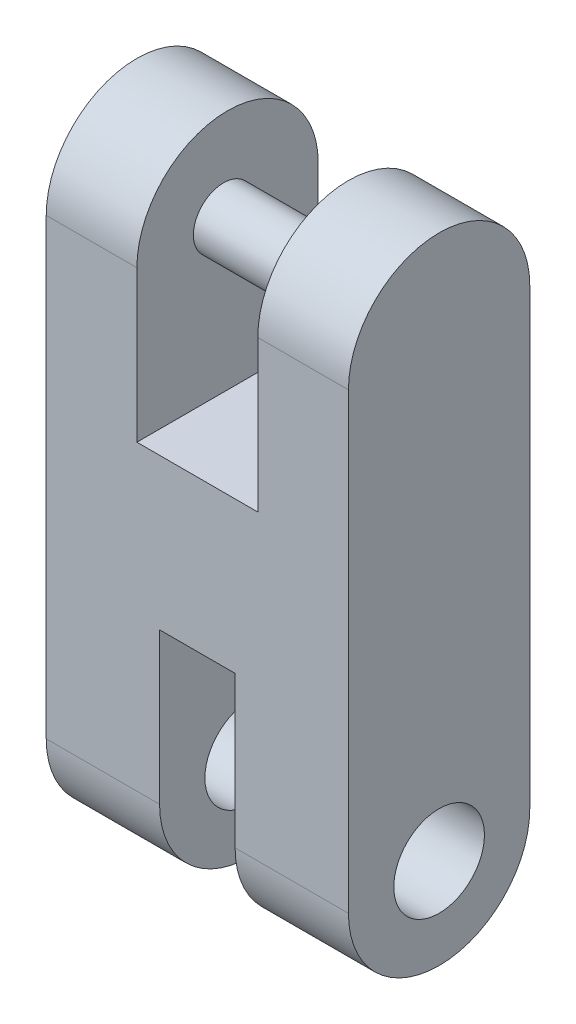
ISO-10303-21;
HEADER;
FILE_DESCRIPTION(('STEP AP214'),'2;1');
FILE_NAME('part.step','',(''),(''),'','','');
FILE_SCHEMA(('AUTOMOTIVE_DESIGN { 1 0 10303 214 1 1 1 1 }'));
ENDSEC;
DATA;
#1=APPLICATION_CONTEXT('core data for automotive mechanical design processes');
#2=APPLICATION_PROTOCOL_DEFINITION('international standard','automotive_design',2000,#1);
#3=PRODUCT_CONTEXT('',#1,'mechanical');
#4=PRODUCT('Part','Part','',(#3));
#5=PRODUCT_RELATED_PRODUCT_CATEGORY('part','',(#4));
#6=PRODUCT_DEFINITION_FORMATION('','',#4);
#7=PRODUCT_DEFINITION_CONTEXT('part definition',#1,'design');
#8=PRODUCT_DEFINITION('design','',#6,#7);
#9=PRODUCT_DEFINITION_SHAPE('','',#8);
#10=(LENGTH_UNIT() NAMED_UNIT(*) SI_UNIT(.MILLI.,.METRE.));
#11=(NAMED_UNIT(*) PLANE_ANGLE_UNIT() SI_UNIT($,.RADIAN.));
#12=(NAMED_UNIT(*) SI_UNIT($,.STERADIAN.) SOLID_ANGLE_UNIT());
#13=UNCERTAINTY_MEASURE_WITH_UNIT(LENGTH_MEASURE(1.E-05),#10,'distance_accuracy_value','');
#14=(GEOMETRIC_REPRESENTATION_CONTEXT(3) GLOBAL_UNCERTAINTY_ASSIGNED_CONTEXT((#13)) GLOBAL_UNIT_ASSIGNED_CONTEXT((#10,
#11,#12)) REPRESENTATION_CONTEXT('',''));
#15=CARTESIAN_POINT('',(0.,0.,0.));
#16=DIRECTION('',(0.,0.,1.));
#17=DIRECTION('',(1.,0.,0.));
#18=AXIS2_PLACEMENT_3D('',#15,#16,#17);
#19=CARTESIAN_POINT('',(-6.25,3.,3.));
#20=DIRECTION('',(1.,0.,0.));
#21=DIRECTION('',(0.,1.,0.));
#22=AXIS2_PLACEMENT_3D('',#19,#20,#21);
#23=CYLINDRICAL_SURFACE('',#22,3.);
#24=DIRECTION('',(1.,0.,0.));
#25=VECTOR('',#24,1.);
#26=CARTESIAN_POINT('',(0.,3.,0.));
#27=LINE('',#26,#25);
#28=CARTESIAN_POINT('',(-6.25,3.,0.));
#29=VERTEX_POINT('',#28);
#30=CARTESIAN_POINT('',(-10.,3.,0.));
#31=VERTEX_POINT('',#30);
#32=EDGE_CURVE('E261',#29,#31,#27,.F.);
#33=ORIENTED_EDGE('',*,*,#32,.F.);
#34=CARTESIAN_POINT('',(-6.25,3.,3.));
#35=DIRECTION('',(-1.,0.,0.));
#36=DIRECTION('',(0.,0.,1.));
#37=AXIS2_PLACEMENT_3D('',#34,#35,#36);
#38=CIRCLE('',#37,3.);
#39=CARTESIAN_POINT('',(-6.25,3.,6.));
#40=VERTEX_POINT('',#39);
#41=EDGE_CURVE('E61',#40,#29,#38,.F.);
#42=ORIENTED_EDGE('',*,*,#41,.F.);
#43=DIRECTION('',(-1.,0.,0.));
#44=VECTOR('',#43,1.);
#45=CARTESIAN_POINT('',(-6.25,3.,6.));
#46=LINE('',#45,#44);
#47=CARTESIAN_POINT('',(-10.,3.,6.));
#48=VERTEX_POINT('',#47);
#49=EDGE_CURVE('E265',#48,#40,#46,.F.);
#50=ORIENTED_EDGE('',*,*,#49,.F.);
#51=CARTESIAN_POINT('',(-10.,3.,3.));
#52=DIRECTION('',(1.,0.,0.));
#53=DIRECTION('',(0.,1.,0.));
#54=AXIS2_PLACEMENT_3D('',#51,#52,#53);
#55=CIRCLE('',#54,3.);
#56=EDGE_CURVE('E69',#31,#48,#55,.F.);
#57=ORIENTED_EDGE('',*,*,#56,.F.);
#58=EDGE_LOOP('',(#33,#42,#50,#57));
#59=FACE_BOUND('',#58,.T.);
#60=ADVANCED_FACE('F45',(#59),#23,.T.);
#61=CARTESIAN_POINT('',(-10.,18.,3.));
#62=DIRECTION('',(-1.,0.,0.));
#63=DIRECTION('',(0.,-1.,0.));
#64=AXIS2_PLACEMENT_3D('',#61,#62,#63);
#65=CYLINDRICAL_SURFACE('',#64,3.);
#66=DIRECTION('',(-1.,0.,0.));
#67=VECTOR('',#66,1.);
#68=CARTESIAN_POINT('',(0.,18.,0.));
#69=LINE('',#68,#67);
#70=CARTESIAN_POINT('',(-10.,18.,0.));
#71=VERTEX_POINT('',#70);
#72=CARTESIAN_POINT('',(-7.,18.,0.));
#73=VERTEX_POINT('',#72);
#74=EDGE_CURVE('E247',#71,#73,#69,.F.);
#75=ORIENTED_EDGE('',*,*,#74,.F.);
#76=CARTESIAN_POINT('',(-10.,18.,3.));
#77=DIRECTION('',(1.,0.,0.));
#78=DIRECTION('',(0.,1.,0.));
#79=AXIS2_PLACEMENT_3D('',#76,#77,#78);
#80=CIRCLE('',#79,3.);
#81=CARTESIAN_POINT('',(-10.,18.,6.));
#82=VERTEX_POINT('',#81);
#83=EDGE_CURVE('E255',#82,#71,#80,.F.);
#84=ORIENTED_EDGE('',*,*,#83,.F.);
#85=DIRECTION('',(1.,0.,0.));
#86=VECTOR('',#85,1.);
#87=CARTESIAN_POINT('',(-10.,18.,6.));
#88=LINE('',#87,#86);
#89=CARTESIAN_POINT('',(-7.,18.,6.));
#90=VERTEX_POINT('',#89);
#91=EDGE_CURVE('E251',#90,#82,#88,.F.);
#92=ORIENTED_EDGE('',*,*,#91,.F.);
#93=CARTESIAN_POINT('',(-7.,18.,3.));
#94=DIRECTION('',(-1.,0.,0.));
#95=DIRECTION('',(0.,-1.,0.));
#96=AXIS2_PLACEMENT_3D('',#93,#94,#95);
#97=CIRCLE('',#96,3.);
#98=EDGE_CURVE('E258',#73,#90,#97,.F.);
#99=ORIENTED_EDGE('',*,*,#98,.F.);
#100=EDGE_LOOP('',(#75,#84,#92,#99));
#101=FACE_BOUND('',#100,.T.);
#102=ADVANCED_FACE('F296',(#101),#65,.T.);
#103=CARTESIAN_POINT('',(0.,18.,3.));
#104=DIRECTION('',(-1.,0.,0.));
#105=DIRECTION('',(0.,-1.,0.));
#106=AXIS2_PLACEMENT_3D('',#103,#104,#105);
#107=CYLINDRICAL_SURFACE('',#106,3.);
#108=DIRECTION('',(1.,0.,0.));
#109=VECTOR('',#108,1.);
#110=CARTESIAN_POINT('',(0.,18.,6.));
#111=LINE('',#110,#109);
#112=CARTESIAN_POINT('',(0.,18.,6.));
#113=VERTEX_POINT('',#112);
#114=CARTESIAN_POINT('',(-3.,18.,6.));
#115=VERTEX_POINT('',#114);
#116=EDGE_CURVE('E146',#113,#115,#111,.F.);
#117=ORIENTED_EDGE('',*,*,#116,.F.);
#118=CARTESIAN_POINT('',(0.,18.,3.));
#119=DIRECTION('',(-1.,0.,0.));
#120=DIRECTION('',(0.,0.,1.));
#121=AXIS2_PLACEMENT_3D('',#118,#119,#120);
#122=CIRCLE('',#121,3.);
#123=CARTESIAN_POINT('',(0.,18.,0.));
#124=VERTEX_POINT('',#123);
#125=EDGE_CURVE('E241',#124,#113,#122,.F.);
#126=ORIENTED_EDGE('',*,*,#125,.F.);
#127=DIRECTION('',(-1.,0.,0.));
#128=VECTOR('',#127,1.);
#129=CARTESIAN_POINT('',(0.,18.,0.));
#130=LINE('',#129,#128);
#131=CARTESIAN_POINT('',(-3.,18.,0.));
#132=VERTEX_POINT('',#131);
#133=EDGE_CURVE('E237',#132,#124,#130,.F.);
#134=ORIENTED_EDGE('',*,*,#133,.F.);
#135=CARTESIAN_POINT('',(-3.,18.,3.));
#136=DIRECTION('',(1.,0.,0.));
#137=DIRECTION('',(0.,1.,0.));
#138=AXIS2_PLACEMENT_3D('',#135,#136,#137);
#139=CIRCLE('',#138,3.);
#140=EDGE_CURVE('E244',#115,#132,#139,.F.);
#141=ORIENTED_EDGE('',*,*,#140,.F.);
#142=EDGE_LOOP('',(#117,#126,#134,#141));
#143=FACE_BOUND('',#142,.T.);
#144=ADVANCED_FACE('F312',(#143),#107,.T.);
#145=CARTESIAN_POINT('',(-7.5,3.,3.));
#146=DIRECTION('',(1.,0.,0.));
#147=DIRECTION('',(0.,1.,0.));
#148=AXIS2_PLACEMENT_3D('',#145,#146,#147);
#149=CYLINDRICAL_SURFACE('',#148,3.);
#150=DIRECTION('',(-1.,0.,0.));
#151=VECTOR('',#150,1.);
#152=CARTESIAN_POINT('',(-7.5,3.,6.));
#153=LINE('',#152,#151);
#154=CARTESIAN_POINT('',(-3.75,3.,6.));
#155=VERTEX_POINT('',#154);
#156=CARTESIAN_POINT('',(0.,3.,6.));
#157=VERTEX_POINT('',#156);
#158=EDGE_CURVE('E159',#155,#157,#153,.F.);
#159=ORIENTED_EDGE('',*,*,#158,.F.);
#160=CARTESIAN_POINT('',(-3.75,3.,3.));
#161=DIRECTION('',(1.,0.,0.));
#162=DIRECTION('',(0.,1.,0.));
#163=AXIS2_PLACEMENT_3D('',#160,#161,#162);
#164=CIRCLE('',#163,3.);
#165=CARTESIAN_POINT('',(-3.75,3.,0.));
#166=VERTEX_POINT('',#165);
#167=EDGE_CURVE('E229',#166,#155,#164,.F.);
#168=ORIENTED_EDGE('',*,*,#167,.F.);
#169=DIRECTION('',(1.,0.,0.));
#170=VECTOR('',#169,1.);
#171=CARTESIAN_POINT('',(0.,3.,0.));
#172=LINE('',#171,#170);
#173=CARTESIAN_POINT('',(0.,3.,0.));
#174=VERTEX_POINT('',#173);
#175=EDGE_CURVE('E225',#174,#166,#172,.F.);
#176=ORIENTED_EDGE('',*,*,#175,.F.);
#177=CARTESIAN_POINT('',(0.,3.,3.));
#178=DIRECTION('',(-1.,0.,0.));
#179=DIRECTION('',(0.,0.,1.));
#180=AXIS2_PLACEMENT_3D('',#177,#178,#179);
#181=CIRCLE('',#180,3.);
#182=EDGE_CURVE('E232',#157,#174,#181,.F.);
#183=ORIENTED_EDGE('',*,*,#182,.F.);
#184=EDGE_LOOP('',(#159,#168,#176,#183));
#185=FACE_BOUND('',#184,.T.);
#186=ADVANCED_FACE('F328',(#185),#149,.T.);
#187=CARTESIAN_POINT('',(0.,0.,6.));
#188=DIRECTION('',(-1.,0.,0.));
#189=DIRECTION('',(0.,0.,1.));
#190=AXIS2_PLACEMENT_3D('',#187,#188,#189);
#191=PLANE('',#190);
#192=CARTESIAN_POINT('',(0.,3.,3.));
#193=DIRECTION('',(1.,0.,0.));
#194=DIRECTION('',(0.,0.,-1.));
#195=AXIS2_PLACEMENT_3D('',#192,#193,#194);
#196=CIRCLE('',#195,1.5);
#197=CARTESIAN_POINT('',(0.,3.,1.5));
#198=VERTEX_POINT('',#197);
#199=EDGE_CURVE('E340',#198,#198,#196,.T.);
#200=ORIENTED_EDGE('',*,*,#199,.F.);
#201=EDGE_LOOP('',(#200));
#202=FACE_BOUND('',#201,.T.);
#203=DIRECTION('',(0.,1.,0.));
#204=VECTOR('',#203,1.);
#205=CARTESIAN_POINT('',(0.,0.,0.));
#206=LINE('',#205,#204);
#207=EDGE_CURVE('E186',#174,#124,#206,.T.);
#208=ORIENTED_EDGE('',*,*,#207,.T.);
#209=ORIENTED_EDGE('',*,*,#125,.T.);
#210=DIRECTION('',(0.,1.,0.));
#211=VECTOR('',#210,1.);
#212=CARTESIAN_POINT('',(0.,0.,6.));
#213=LINE('',#212,#211);
#214=EDGE_CURVE('E149',#157,#113,#213,.T.);
#215=ORIENTED_EDGE('',*,*,#214,.F.);
#216=ORIENTED_EDGE('',*,*,#182,.T.);
#217=EDGE_LOOP('',(#208,#209,#215,#216));
#218=FACE_BOUND('',#217,.T.);
#219=ADVANCED_FACE('F331',(#202,#218),#191,.F.);
#220=CARTESIAN_POINT('',(-3.,13.,6.));
#221=DIRECTION('',(1.,0.,0.));
#222=DIRECTION('',(0.,1.,0.));
#223=AXIS2_PLACEMENT_3D('',#220,#221,#222);
#224=PLANE('',#223);
#225=CARTESIAN_POINT('',(-3.,18.,3.13085632052434));
#226=DIRECTION('',(1.,0.,0.));
#227=DIRECTION('',(0.,1.,0.));
#228=AXIS2_PLACEMENT_3D('',#225,#226,#227);
#229=CIRCLE('',#228,1.);
#230=CARTESIAN_POINT('',(-3.,19.,3.13085632052434));
#231=VERTEX_POINT('',#230);
#232=EDGE_CURVE('E11',#231,#231,#229,.F.);
#233=ORIENTED_EDGE('',*,*,#232,.F.);
#234=EDGE_LOOP('',(#233));
#235=FACE_BOUND('',#234,.T.);
#236=DIRECTION('',(0.,-1.,0.));
#237=VECTOR('',#236,1.);
#238=CARTESIAN_POINT('',(-3.,13.,6.));
#239=LINE('',#238,#237);
#240=CARTESIAN_POINT('',(-3.,13.,6.));
#241=VERTEX_POINT('',#240);
#242=EDGE_CURVE('E136',#115,#241,#239,.T.);
#243=ORIENTED_EDGE('',*,*,#242,.F.);
#244=ORIENTED_EDGE('',*,*,#140,.T.);
#245=DIRECTION('',(0.,-1.,0.));
#246=VECTOR('',#245,1.);
#247=CARTESIAN_POINT('',(-3.,13.,0.));
#248=LINE('',#247,#246);
#249=CARTESIAN_POINT('',(-3.,13.,0.));
#250=VERTEX_POINT('',#249);
#251=EDGE_CURVE('E155',#132,#250,#248,.T.);
#252=ORIENTED_EDGE('',*,*,#251,.T.);
#253=DIRECTION('',(0.,0.,-1.));
#254=VECTOR('',#253,1.);
#255=CARTESIAN_POINT('',(-3.,13.,6.));
#256=LINE('',#255,#254);
#257=EDGE_CURVE('E152',#241,#250,#256,.T.);
#258=ORIENTED_EDGE('',*,*,#257,.F.);
#259=EDGE_LOOP('',(#243,#244,#252,#258));
#260=FACE_BOUND('',#259,.T.);
#261=ADVANCED_FACE('F153',(#235,#260),#224,.F.);
#262=CARTESIAN_POINT('',(-7.,13.,6.));
#263=DIRECTION('',(0.,-1.,0.));
#264=DIRECTION('',(0.,0.,-1.));
#265=AXIS2_PLACEMENT_3D('',#262,#263,#264);
#266=PLANE('',#265);
#267=DIRECTION('',(-1.,0.,0.));
#268=VECTOR('',#267,1.);
#269=CARTESIAN_POINT('',(-7.,13.,0.));
#270=LINE('',#269,#268);
#271=CARTESIAN_POINT('',(-7.,13.,0.));
#272=VERTEX_POINT('',#271);
#273=EDGE_CURVE('E193',#250,#272,#270,.T.);
#274=ORIENTED_EDGE('',*,*,#273,.T.);
#275=DIRECTION('',(0.,0.,-1.));
#276=VECTOR('',#275,1.);
#277=CARTESIAN_POINT('',(-7.,13.,6.));
#278=LINE('',#277,#276);
#279=CARTESIAN_POINT('',(-7.,13.,6.));
#280=VERTEX_POINT('',#279);
#281=EDGE_CURVE('E160',#280,#272,#278,.T.);
#282=ORIENTED_EDGE('',*,*,#281,.F.);
#283=DIRECTION('',(-1.,0.,0.));
#284=VECTOR('',#283,1.);
#285=CARTESIAN_POINT('',(-7.,13.,6.));
#286=LINE('',#285,#284);
#287=EDGE_CURVE('E142',#241,#280,#286,.T.);
#288=ORIENTED_EDGE('',*,*,#287,.F.);
#289=ORIENTED_EDGE('',*,*,#257,.T.);
#290=EDGE_LOOP('',(#274,#282,#288,#289));
#291=FACE_BOUND('',#290,.T.);
#292=ADVANCED_FACE('F162',(#291),#266,.F.);
#293=CARTESIAN_POINT('',(-7.,21.,6.));
#294=DIRECTION('',(-1.,0.,0.));
#295=DIRECTION('',(0.,-1.,0.));
#296=AXIS2_PLACEMENT_3D('',#293,#294,#295);
#297=PLANE('',#296);
#298=CARTESIAN_POINT('',(-7.,18.,3.13085632052434));
#299=DIRECTION('',(-1.,0.,0.));
#300=DIRECTION('',(0.,-1.,0.));
#301=AXIS2_PLACEMENT_3D('',#298,#299,#300);
#302=CIRCLE('',#301,1.);
#303=CARTESIAN_POINT('',(-7.,17.,3.13085632052434));
#304=VERTEX_POINT('',#303);
#305=EDGE_CURVE('E54',#304,#304,#302,.F.);
#306=ORIENTED_EDGE('',*,*,#305,.F.);
#307=EDGE_LOOP('',(#306));
#308=FACE_BOUND('',#307,.T.);
#309=DIRECTION('',(0.,1.,0.));
#310=VECTOR('',#309,1.);
#311=CARTESIAN_POINT('',(-7.,21.,0.));
#312=LINE('',#311,#310);
#313=EDGE_CURVE('E196',#272,#73,#312,.T.);
#314=ORIENTED_EDGE('',*,*,#313,.T.);
#315=ORIENTED_EDGE('',*,*,#98,.T.);
#316=DIRECTION('',(0.,1.,0.));
#317=VECTOR('',#316,1.);
#318=CARTESIAN_POINT('',(-7.,21.,6.));
#319=LINE('',#318,#317);
#320=EDGE_CURVE('E166',#280,#90,#319,.T.);
#321=ORIENTED_EDGE('',*,*,#320,.F.);
#322=ORIENTED_EDGE('',*,*,#281,.T.);
#323=EDGE_LOOP('',(#314,#315,#321,#322));
#324=FACE_BOUND('',#323,.T.);
#325=ADVANCED_FACE('F283',(#308,#324),#297,.F.);
#326=CARTESIAN_POINT('',(-10.,0.,6.));
#327=DIRECTION('',(1.,0.,0.));
#328=DIRECTION('',(0.,1.,0.));
#329=AXIS2_PLACEMENT_3D('',#326,#327,#328);
#330=PLANE('',#329);
#331=CARTESIAN_POINT('',(-10.,3.,3.));
#332=DIRECTION('',(1.,0.,0.));
#333=DIRECTION('',(0.,1.,0.));
#334=AXIS2_PLACEMENT_3D('',#331,#332,#333);
#335=CIRCLE('',#334,1.5);
#336=CARTESIAN_POINT('',(-10.,4.5,3.));
#337=VERTEX_POINT('',#336);
#338=EDGE_CURVE('E275',#337,#337,#335,.F.);
#339=ORIENTED_EDGE('',*,*,#338,.F.);
#340=EDGE_LOOP('',(#339));
#341=FACE_BOUND('',#340,.T.);
#342=DIRECTION('',(0.,-1.,0.));
#343=VECTOR('',#342,1.);
#344=CARTESIAN_POINT('',(-10.,0.,0.));
#345=LINE('',#344,#343);
#346=EDGE_CURVE('E200',#71,#31,#345,.T.);
#347=ORIENTED_EDGE('',*,*,#346,.T.);
#348=ORIENTED_EDGE('',*,*,#56,.T.);
#349=DIRECTION('',(0.,-1.,0.));
#350=VECTOR('',#349,1.);
#351=CARTESIAN_POINT('',(-10.,0.,6.));
#352=LINE('',#351,#350);
#353=EDGE_CURVE('E169',#82,#48,#352,.T.);
#354=ORIENTED_EDGE('',*,*,#353,.F.);
#355=ORIENTED_EDGE('',*,*,#83,.T.);
#356=EDGE_LOOP('',(#347,#348,#354,#355));
#357=FACE_BOUND('',#356,.T.);
#358=ADVANCED_FACE('F286',(#341,#357),#330,.F.);
#359=CARTESIAN_POINT('',(-6.25,0.,6.));
#360=DIRECTION('',(-1.,0.,0.));
#361=DIRECTION('',(0.,0.,1.));
#362=AXIS2_PLACEMENT_3D('',#359,#360,#361);
#363=PLANE('',#362);
#364=CARTESIAN_POINT('',(-6.25,3.,3.));
#365=DIRECTION('',(-1.,0.,0.));
#366=DIRECTION('',(0.,0.,1.));
#367=AXIS2_PLACEMENT_3D('',#364,#365,#366);
#368=CIRCLE('',#367,1.5);
#369=CARTESIAN_POINT('',(-6.25,3.,4.5));
#370=VERTEX_POINT('',#369);
#371=EDGE_CURVE('E190',#370,#370,#368,.T.);
#372=ORIENTED_EDGE('',*,*,#371,.T.);
#373=EDGE_LOOP('',(#372));
#374=FACE_BOUND('',#373,.T.);
#375=DIRECTION('',(0.,1.,0.));
#376=VECTOR('',#375,1.);
#377=CARTESIAN_POINT('',(-6.25,0.,6.));
#378=LINE('',#377,#376);
#379=CARTESIAN_POINT('',(-6.25,8.,6.));
#380=VERTEX_POINT('',#379);
#381=EDGE_CURVE('E175',#40,#380,#378,.T.);
#382=ORIENTED_EDGE('',*,*,#381,.F.);
#383=ORIENTED_EDGE('',*,*,#41,.T.);
#384=DIRECTION('',(0.,1.,0.));
#385=VECTOR('',#384,1.);
#386=CARTESIAN_POINT('',(-6.25,0.,0.));
#387=LINE('',#386,#385);
#388=CARTESIAN_POINT('',(-6.25,8.,0.));
#389=VERTEX_POINT('',#388);
#390=EDGE_CURVE('E203',#29,#389,#387,.T.);
#391=ORIENTED_EDGE('',*,*,#390,.T.);
#392=DIRECTION('',(0.,0.,-1.));
#393=VECTOR('',#392,1.);
#394=CARTESIAN_POINT('',(-6.25,8.,6.));
#395=LINE('',#394,#393);
#396=EDGE_CURVE('E216',#380,#389,#395,.T.);
#397=ORIENTED_EDGE('',*,*,#396,.F.);
#398=EDGE_LOOP('',(#382,#383,#391,#397));
#399=FACE_BOUND('',#398,.T.);
#400=ADVANCED_FACE('F298',(#374,#399),#363,.F.);
#401=CARTESIAN_POINT('',(-6.25,8.,6.));
#402=DIRECTION('',(0.,1.,0.));
#403=DIRECTION('',(-1.,0.,0.));
#404=AXIS2_PLACEMENT_3D('',#401,#402,#403);
#405=PLANE('',#404);
#406=DIRECTION('',(1.,0.,0.));
#407=VECTOR('',#406,1.);
#408=CARTESIAN_POINT('',(-6.25,8.,0.));
#409=LINE('',#408,#407);
#410=CARTESIAN_POINT('',(-3.75,8.,0.));
#411=VERTEX_POINT('',#410);
#412=EDGE_CURVE('E206',#389,#411,#409,.T.);
#413=ORIENTED_EDGE('',*,*,#412,.T.);
#414=DIRECTION('',(0.,0.,-1.));
#415=VECTOR('',#414,1.);
#416=CARTESIAN_POINT('',(-3.75,8.,6.));
#417=LINE('',#416,#415);
#418=CARTESIAN_POINT('',(-3.75,8.,6.));
#419=VERTEX_POINT('',#418);
#420=EDGE_CURVE('E185',#419,#411,#417,.T.);
#421=ORIENTED_EDGE('',*,*,#420,.F.);
#422=DIRECTION('',(1.,0.,0.));
#423=VECTOR('',#422,1.);
#424=CARTESIAN_POINT('',(-6.25,8.,6.));
#425=LINE('',#424,#423);
#426=EDGE_CURVE('E178',#380,#419,#425,.T.);
#427=ORIENTED_EDGE('',*,*,#426,.F.);
#428=ORIENTED_EDGE('',*,*,#396,.T.);
#429=EDGE_LOOP('',(#413,#421,#427,#428));
#430=FACE_BOUND('',#429,.T.);
#431=ADVANCED_FACE('F304',(#430),#405,.F.);
#432=CARTESIAN_POINT('',(-3.75,8.,6.));
#433=DIRECTION('',(1.,0.,0.));
#434=DIRECTION('',(0.,1.,0.));
#435=AXIS2_PLACEMENT_3D('',#432,#433,#434);
#436=PLANE('',#435);
#437=CARTESIAN_POINT('',(-3.75,3.,3.));
#438=DIRECTION('',(1.,0.,0.));
#439=DIRECTION('',(0.,1.,0.));
#440=AXIS2_PLACEMENT_3D('',#437,#438,#439);
#441=CIRCLE('',#440,1.5);
#442=CARTESIAN_POINT('',(-3.75,4.5,3.));
#443=VERTEX_POINT('',#442);
#444=EDGE_CURVE('E272',#443,#443,#441,.T.);
#445=ORIENTED_EDGE('',*,*,#444,.T.);
#446=EDGE_LOOP('',(#445));
#447=FACE_BOUND('',#446,.T.);
#448=DIRECTION('',(0.,-1.,0.));
#449=VECTOR('',#448,1.);
#450=CARTESIAN_POINT('',(-3.75,8.,0.));
#451=LINE('',#450,#449);
#452=EDGE_CURVE('E209',#411,#166,#451,.T.);
#453=ORIENTED_EDGE('',*,*,#452,.T.);
#454=ORIENTED_EDGE('',*,*,#167,.T.);
#455=DIRECTION('',(0.,-1.,0.));
#456=VECTOR('',#455,1.);
#457=CARTESIAN_POINT('',(-3.75,8.,6.));
#458=LINE('',#457,#456);
#459=EDGE_CURVE('E181',#419,#155,#458,.T.);
#460=ORIENTED_EDGE('',*,*,#459,.F.);
#461=ORIENTED_EDGE('',*,*,#420,.T.);
#462=EDGE_LOOP('',(#453,#454,#460,#461));
#463=FACE_BOUND('',#462,.T.);
#464=ADVANCED_FACE('F325',(#447,#463),#436,.F.);
#465=CARTESIAN_POINT('',(0.,0.,6.));
#466=DIRECTION('',(0.,0.,1.));
#467=DIRECTION('',(1.,0.,0.));
#468=AXIS2_PLACEMENT_3D('',#465,#466,#467);
#469=PLANE('',#468);
#470=ORIENTED_EDGE('',*,*,#353,.T.);
#471=ORIENTED_EDGE('',*,*,#49,.T.);
#472=ORIENTED_EDGE('',*,*,#381,.T.);
#473=ORIENTED_EDGE('',*,*,#426,.T.);
#474=ORIENTED_EDGE('',*,*,#459,.T.);
#475=ORIENTED_EDGE('',*,*,#158,.T.);
#476=ORIENTED_EDGE('',*,*,#214,.T.);
#477=ORIENTED_EDGE('',*,*,#116,.T.);
#478=ORIENTED_EDGE('',*,*,#242,.T.);
#479=ORIENTED_EDGE('',*,*,#287,.T.);
#480=ORIENTED_EDGE('',*,*,#320,.T.);
#481=ORIENTED_EDGE('',*,*,#91,.T.);
#482=EDGE_LOOP('',(#470,#471,#472,#473,#474,#475,#476,#477,#478,#479,#480,#481));
#483=FACE_BOUND('',#482,.T.);
#484=ADVANCED_FACE('F139',(#483),#469,.T.);
#485=CARTESIAN_POINT('',(0.,0.,0.));
#486=DIRECTION('',(0.,0.,1.));
#487=DIRECTION('',(1.,0.,0.));
#488=AXIS2_PLACEMENT_3D('',#485,#486,#487);
#489=PLANE('',#488);
#490=ORIENTED_EDGE('',*,*,#390,.F.);
#491=ORIENTED_EDGE('',*,*,#32,.T.);
#492=ORIENTED_EDGE('',*,*,#346,.F.);
#493=ORIENTED_EDGE('',*,*,#74,.T.);
#494=ORIENTED_EDGE('',*,*,#313,.F.);
#495=ORIENTED_EDGE('',*,*,#273,.F.);
#496=ORIENTED_EDGE('',*,*,#251,.F.);
#497=ORIENTED_EDGE('',*,*,#133,.T.);
#498=ORIENTED_EDGE('',*,*,#207,.F.);
#499=ORIENTED_EDGE('',*,*,#175,.T.);
#500=ORIENTED_EDGE('',*,*,#452,.F.);
#501=ORIENTED_EDGE('',*,*,#412,.F.);
#502=EDGE_LOOP('',(#490,#491,#492,#493,#494,#495,#496,#497,#498,#499,#500,#501));
#503=FACE_BOUND('',#502,.T.);
#504=ADVANCED_FACE('F292',(#503),#489,.F.);
#505=CARTESIAN_POINT('',(-14.2426406871193,3.,3.));
#506=DIRECTION('',(1.,0.,0.));
#507=DIRECTION('',(0.,0.,-1.));
#508=AXIS2_PLACEMENT_3D('',#505,#506,#507);
#509=CYLINDRICAL_SURFACE('',#508,1.5);
#510=ORIENTED_EDGE('',*,*,#199,.T.);
#511=EDGE_LOOP('',(#510));
#512=FACE_BOUND('',#511,.T.);
#513=ORIENTED_EDGE('',*,*,#444,.F.);
#514=EDGE_LOOP('',(#513));
#515=FACE_BOUND('',#514,.T.);
#516=ADVANCED_FACE('F345',(#512,#515),#509,.F.);
#517=ORIENTED_EDGE('',*,*,#338,.T.);
#518=EDGE_LOOP('',(#517));
#519=FACE_BOUND('',#518,.T.);
#520=ORIENTED_EDGE('',*,*,#371,.F.);
#521=EDGE_LOOP('',(#520));
#522=FACE_BOUND('',#521,.T.);
#523=ADVANCED_FACE('F423',(#519,#522),#509,.F.);
#524=CARTESIAN_POINT('',(0.00200000000000027,18.,3.13085632052434));
#525=DIRECTION('',(-1.,0.,0.));
#526=DIRECTION('',(0.,-1.,0.));
#527=AXIS2_PLACEMENT_3D('',#524,#525,#526);
#528=CYLINDRICAL_SURFACE('',#527,1.);
#529=ORIENTED_EDGE('',*,*,#305,.T.);
#530=EDGE_LOOP('',(#529));
#531=FACE_BOUND('',#530,.T.);
#532=ORIENTED_EDGE('',*,*,#232,.T.);
#533=EDGE_LOOP('',(#532));
#534=FACE_BOUND('',#533,.T.);
#535=ADVANCED_FACE('F280',(#531,#534),#528,.T.);
#536=CLOSED_SHELL('',(#60,#102,#144,#186,#219,#261,#292,#325,#358,#400,#431,#464,#484,#504,#516,
#523,#535));
#537=MANIFOLD_SOLID_BREP('B2',#536);
#538=ADVANCED_BREP_SHAPE_REPRESENTATION('',(#18,#537),#14);
#539=SHAPE_DEFINITION_REPRESENTATION(#9,#538);
ENDSEC;
END-ISO-10303-21;
